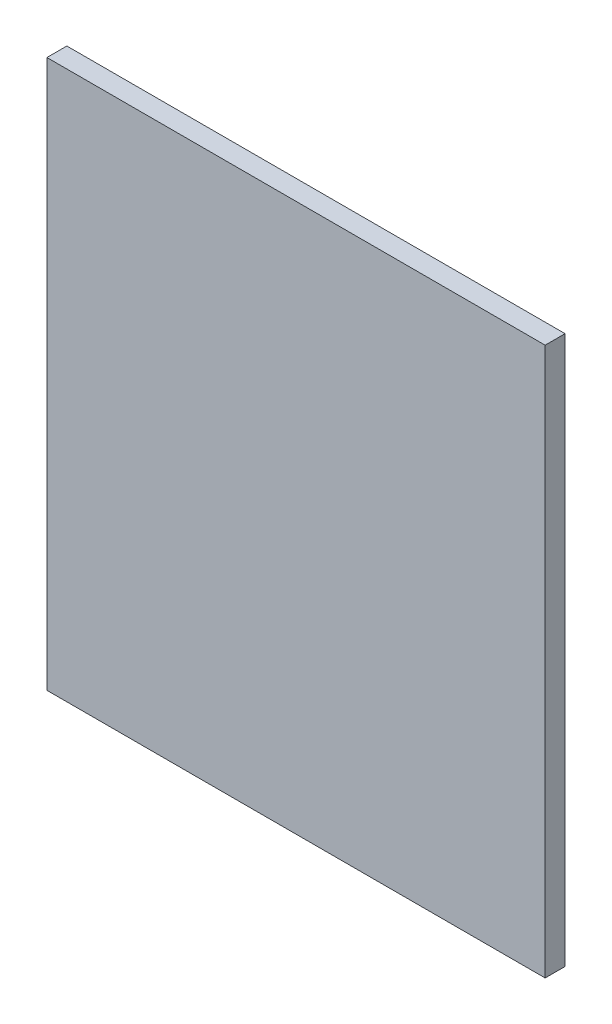
ISO-10303-21;
HEADER;
FILE_DESCRIPTION(('STEP AP214'),'2;1');
FILE_NAME('part.step','',(''),(''),'','','');
FILE_SCHEMA(('AUTOMOTIVE_DESIGN { 1 0 10303 214 1 1 1 1 }'));
ENDSEC;
DATA;
#1=APPLICATION_CONTEXT('core data for automotive mechanical design processes');
#2=APPLICATION_PROTOCOL_DEFINITION('international standard','automotive_design',2000,#1);
#3=PRODUCT_CONTEXT('',#1,'mechanical');
#4=PRODUCT('Part','Part','',(#3));
#5=PRODUCT_RELATED_PRODUCT_CATEGORY('part','',(#4));
#6=PRODUCT_DEFINITION_FORMATION('','',#4);
#7=PRODUCT_DEFINITION_CONTEXT('part definition',#1,'design');
#8=PRODUCT_DEFINITION('design','',#6,#7);
#9=PRODUCT_DEFINITION_SHAPE('','',#8);
#10=(LENGTH_UNIT() NAMED_UNIT(*) SI_UNIT(.MILLI.,.METRE.));
#11=(NAMED_UNIT(*) PLANE_ANGLE_UNIT() SI_UNIT($,.RADIAN.));
#12=(NAMED_UNIT(*) SI_UNIT($,.STERADIAN.) SOLID_ANGLE_UNIT());
#13=UNCERTAINTY_MEASURE_WITH_UNIT(LENGTH_MEASURE(1.E-05),#10,'distance_accuracy_value','');
#14=(GEOMETRIC_REPRESENTATION_CONTEXT(3) GLOBAL_UNCERTAINTY_ASSIGNED_CONTEXT((#13)) GLOBAL_UNIT_ASSIGNED_CONTEXT((#10,
#11,#12)) REPRESENTATION_CONTEXT('',''));
#15=CARTESIAN_POINT('',(0.,0.,0.));
#16=DIRECTION('',(0.,0.,1.));
#17=DIRECTION('',(1.,0.,0.));
#18=AXIS2_PLACEMENT_3D('',#15,#16,#17);
#19=CARTESIAN_POINT('',(0.,0.,2.));
#20=DIRECTION('',(1.,0.,0.));
#21=DIRECTION('',(0.,0.,-1.));
#22=AXIS2_PLACEMENT_3D('',#19,#20,#21);
#23=PLANE('',#22);
#24=DIRECTION('',(0.,-1.,0.));
#25=VECTOR('',#24,1.);
#26=CARTESIAN_POINT('',(0.,0.,0.));
#27=LINE('',#26,#25);
#28=CARTESIAN_POINT('',(0.,55.,0.));
#29=VERTEX_POINT('',#28);
#30=CARTESIAN_POINT('',(0.,0.,0.));
#31=VERTEX_POINT('',#30);
#32=EDGE_CURVE('E108',#29,#31,#27,.T.);
#33=ORIENTED_EDGE('',*,*,#32,.T.);
#34=DIRECTION('',(0.,0.,-1.));
#35=VECTOR('',#34,1.);
#36=CARTESIAN_POINT('',(0.,0.,2.));
#37=LINE('',#36,#35);
#38=CARTESIAN_POINT('',(0.,0.,2.));
#39=VERTEX_POINT('',#38);
#40=EDGE_CURVE('E11',#39,#31,#37,.T.);
#41=ORIENTED_EDGE('',*,*,#40,.F.);
#42=DIRECTION('',(0.,-1.,0.));
#43=VECTOR('',#42,1.);
#44=CARTESIAN_POINT('',(0.,0.,2.));
#45=LINE('',#44,#43);
#46=CARTESIAN_POINT('',(0.,55.,2.));
#47=VERTEX_POINT('',#46);
#48=EDGE_CURVE('E92',#47,#39,#45,.T.);
#49=ORIENTED_EDGE('',*,*,#48,.F.);
#50=DIRECTION('',(0.,0.,-1.));
#51=VECTOR('',#50,1.);
#52=CARTESIAN_POINT('',(0.,55.,2.));
#53=LINE('',#52,#51);
#54=EDGE_CURVE('E105',#47,#29,#53,.T.);
#55=ORIENTED_EDGE('',*,*,#54,.T.);
#56=EDGE_LOOP('',(#33,#41,#49,#55));
#57=FACE_BOUND('',#56,.T.);
#58=ADVANCED_FACE('F43',(#57),#23,.F.);
#59=CARTESIAN_POINT('',(0.,0.,2.));
#60=DIRECTION('',(0.,1.,0.));
#61=DIRECTION('',(0.,0.,1.));
#62=AXIS2_PLACEMENT_3D('',#59,#60,#61);
#63=PLANE('',#62);
#64=DIRECTION('',(1.,0.,0.));
#65=VECTOR('',#64,1.);
#66=CARTESIAN_POINT('',(0.,0.,0.));
#67=LINE('',#66,#65);
#68=CARTESIAN_POINT('',(50.,0.,0.));
#69=VERTEX_POINT('',#68);
#70=EDGE_CURVE('E97',#31,#69,#67,.T.);
#71=ORIENTED_EDGE('',*,*,#70,.T.);
#72=DIRECTION('',(0.,0.,-1.));
#73=VECTOR('',#72,1.);
#74=CARTESIAN_POINT('',(50.,0.,2.));
#75=LINE('',#74,#73);
#76=CARTESIAN_POINT('',(50.,0.,2.));
#77=VERTEX_POINT('',#76);
#78=EDGE_CURVE('E51',#77,#69,#75,.T.);
#79=ORIENTED_EDGE('',*,*,#78,.F.);
#80=DIRECTION('',(1.,0.,0.));
#81=VECTOR('',#80,1.);
#82=CARTESIAN_POINT('',(0.,0.,2.));
#83=LINE('',#82,#81);
#84=EDGE_CURVE('E87',#39,#77,#83,.T.);
#85=ORIENTED_EDGE('',*,*,#84,.F.);
#86=ORIENTED_EDGE('',*,*,#40,.T.);
#87=EDGE_LOOP('',(#71,#79,#85,#86));
#88=FACE_BOUND('',#87,.T.);
#89=ADVANCED_FACE('F100',(#88),#63,.F.);
#90=CARTESIAN_POINT('',(50.,0.,2.));
#91=DIRECTION('',(-1.,0.,0.));
#92=DIRECTION('',(0.,0.,1.));
#93=AXIS2_PLACEMENT_3D('',#90,#91,#92);
#94=PLANE('',#93);
#95=DIRECTION('',(0.,1.,0.));
#96=VECTOR('',#95,1.);
#97=CARTESIAN_POINT('',(50.,0.,0.));
#98=LINE('',#97,#96);
#99=CARTESIAN_POINT('',(50.,55.,0.));
#100=VERTEX_POINT('',#99);
#101=EDGE_CURVE('E78',#69,#100,#98,.T.);
#102=ORIENTED_EDGE('',*,*,#101,.T.);
#103=DIRECTION('',(0.,0.,-1.));
#104=VECTOR('',#103,1.);
#105=CARTESIAN_POINT('',(50.,55.,2.));
#106=LINE('',#105,#104);
#107=CARTESIAN_POINT('',(50.,55.,2.));
#108=VERTEX_POINT('',#107);
#109=EDGE_CURVE('E98',#108,#100,#106,.T.);
#110=ORIENTED_EDGE('',*,*,#109,.F.);
#111=DIRECTION('',(0.,1.,0.));
#112=VECTOR('',#111,1.);
#113=CARTESIAN_POINT('',(50.,0.,2.));
#114=LINE('',#113,#112);
#115=EDGE_CURVE('E95',#77,#108,#114,.T.);
#116=ORIENTED_EDGE('',*,*,#115,.F.);
#117=ORIENTED_EDGE('',*,*,#78,.T.);
#118=EDGE_LOOP('',(#102,#110,#116,#117));
#119=FACE_BOUND('',#118,.T.);
#120=ADVANCED_FACE('F99',(#119),#94,.F.);
#121=CARTESIAN_POINT('',(0.,55.,2.));
#122=DIRECTION('',(0.,-1.,0.));
#123=DIRECTION('',(0.,0.,-1.));
#124=AXIS2_PLACEMENT_3D('',#121,#122,#123);
#125=PLANE('',#124);
#126=DIRECTION('',(-1.,0.,0.));
#127=VECTOR('',#126,1.);
#128=CARTESIAN_POINT('',(0.,55.,0.));
#129=LINE('',#128,#127);
#130=EDGE_CURVE('E85',#100,#29,#129,.T.);
#131=ORIENTED_EDGE('',*,*,#130,.T.);
#132=ORIENTED_EDGE('',*,*,#54,.F.);
#133=DIRECTION('',(-1.,0.,0.));
#134=VECTOR('',#133,1.);
#135=CARTESIAN_POINT('',(0.,55.,2.));
#136=LINE('',#135,#134);
#137=EDGE_CURVE('E56',#108,#47,#136,.T.);
#138=ORIENTED_EDGE('',*,*,#137,.F.);
#139=ORIENTED_EDGE('',*,*,#109,.T.);
#140=EDGE_LOOP('',(#131,#132,#138,#139));
#141=FACE_BOUND('',#140,.T.);
#142=ADVANCED_FACE('F111',(#141),#125,.F.);
#143=CARTESIAN_POINT('',(0.,0.,2.));
#144=DIRECTION('',(0.,0.,-1.));
#145=DIRECTION('',(-1.,0.,0.));
#146=AXIS2_PLACEMENT_3D('',#143,#144,#145);
#147=PLANE('',#146);
#148=ORIENTED_EDGE('',*,*,#48,.T.);
#149=ORIENTED_EDGE('',*,*,#84,.T.);
#150=ORIENTED_EDGE('',*,*,#115,.T.);
#151=ORIENTED_EDGE('',*,*,#137,.T.);
#152=EDGE_LOOP('',(#148,#149,#150,#151));
#153=FACE_BOUND('',#152,.T.);
#154=ADVANCED_FACE('F89',(#153),#147,.F.);
#155=CARTESIAN_POINT('',(0.,0.,0.));
#156=DIRECTION('',(0.,0.,-1.));
#157=DIRECTION('',(-1.,0.,0.));
#158=AXIS2_PLACEMENT_3D('',#155,#156,#157);
#159=PLANE('',#158);
#160=ORIENTED_EDGE('',*,*,#32,.F.);
#161=ORIENTED_EDGE('',*,*,#130,.F.);
#162=ORIENTED_EDGE('',*,*,#101,.F.);
#163=ORIENTED_EDGE('',*,*,#70,.F.);
#164=EDGE_LOOP('',(#160,#161,#162,#163));
#165=FACE_BOUND('',#164,.T.);
#166=ADVANCED_FACE('F118',(#165),#159,.T.);
#167=CLOSED_SHELL('',(#58,#89,#120,#142,#154,#166));
#168=MANIFOLD_SOLID_BREP('B2',#167);
#169=ADVANCED_BREP_SHAPE_REPRESENTATION('',(#18,#168),#14);
#170=SHAPE_DEFINITION_REPRESENTATION(#9,#169);
ENDSEC;
END-ISO-10303-21;
